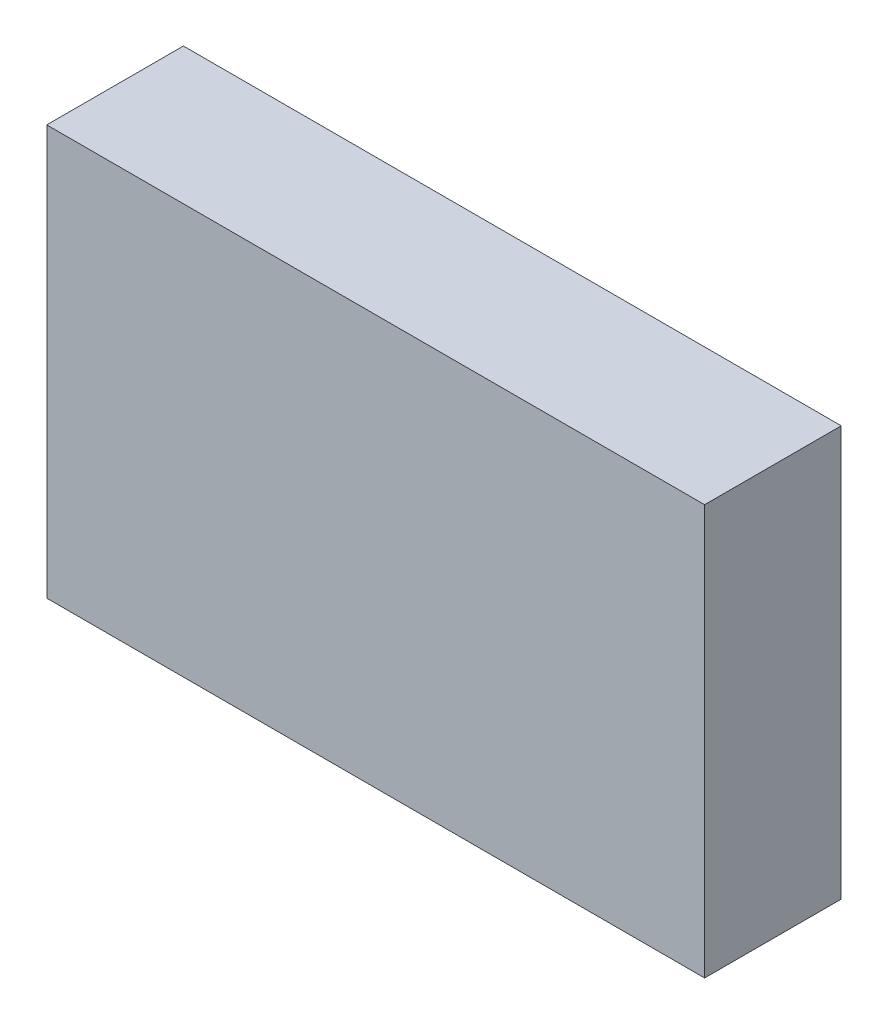
ISO-10303-21;
HEADER;
FILE_DESCRIPTION(('STEP AP214'),'2;1');
FILE_NAME('part.step','',(''),(''),'','','');
FILE_SCHEMA(('AUTOMOTIVE_DESIGN { 1 0 10303 214 1 1 1 1 }'));
ENDSEC;
DATA;
#1=APPLICATION_CONTEXT('core data for automotive mechanical design processes');
#2=APPLICATION_PROTOCOL_DEFINITION('international standard','automotive_design',2000,#1);
#3=PRODUCT_CONTEXT('',#1,'mechanical');
#4=PRODUCT('Part','Part','',(#3));
#5=PRODUCT_RELATED_PRODUCT_CATEGORY('part','',(#4));
#6=PRODUCT_DEFINITION_FORMATION('','',#4);
#7=PRODUCT_DEFINITION_CONTEXT('part definition',#1,'design');
#8=PRODUCT_DEFINITION('design','',#6,#7);
#9=PRODUCT_DEFINITION_SHAPE('','',#8);
#10=(LENGTH_UNIT() NAMED_UNIT(*) SI_UNIT(.MILLI.,.METRE.));
#11=(NAMED_UNIT(*) PLANE_ANGLE_UNIT() SI_UNIT($,.RADIAN.));
#12=(NAMED_UNIT(*) SI_UNIT($,.STERADIAN.) SOLID_ANGLE_UNIT());
#13=UNCERTAINTY_MEASURE_WITH_UNIT(LENGTH_MEASURE(1.E-05),#10,'distance_accuracy_value','');
#14=(GEOMETRIC_REPRESENTATION_CONTEXT(3) GLOBAL_UNCERTAINTY_ASSIGNED_CONTEXT((#13)) GLOBAL_UNIT_ASSIGNED_CONTEXT((#10,
#11,#12)) REPRESENTATION_CONTEXT('',''));
#15=CARTESIAN_POINT('',(0.,0.,0.));
#16=DIRECTION('',(0.,0.,1.));
#17=DIRECTION('',(1.,0.,0.));
#18=AXIS2_PLACEMENT_3D('',#15,#16,#17);
#19=CARTESIAN_POINT('',(-0.0762,-1.0287,0.7366));
#20=DIRECTION('',(0.,0.,1.));
#21=DIRECTION('',(1.,0.,0.));
#22=AXIS2_PLACEMENT_3D('',#19,#20,#21);
#23=PLANE('',#22);
#24=DIRECTION('',(0.,1.,0.));
#25=VECTOR('',#24,1.);
#26=CARTESIAN_POINT('',(3.2258,-1.0287,0.7366));
#27=LINE('',#26,#25);
#28=CARTESIAN_POINT('',(3.2258,1.0287,0.7366));
#29=VERTEX_POINT('',#28);
#30=CARTESIAN_POINT('',(3.2258,-1.0287,0.7366));
#31=VERTEX_POINT('',#30);
#32=EDGE_CURVE('E76',#29,#31,#27,.F.);
#33=ORIENTED_EDGE('',*,*,#32,.F.);
#34=DIRECTION('',(1.,0.,0.));
#35=VECTOR('',#34,1.);
#36=CARTESIAN_POINT('',(-0.0762,1.0287,0.7366));
#37=LINE('',#36,#35);
#38=CARTESIAN_POINT('',(-0.0762,1.0287,0.7366));
#39=VERTEX_POINT('',#38);
#40=EDGE_CURVE('E58',#39,#29,#37,.T.);
#41=ORIENTED_EDGE('',*,*,#40,.F.);
#42=DIRECTION('',(0.,1.,0.));
#43=VECTOR('',#42,1.);
#44=CARTESIAN_POINT('',(-0.0762,-1.0287,0.7366));
#45=LINE('',#44,#43);
#46=CARTESIAN_POINT('',(-0.0762,-1.0287,0.7366));
#47=VERTEX_POINT('',#46);
#48=EDGE_CURVE('E20',#39,#47,#45,.F.);
#49=ORIENTED_EDGE('',*,*,#48,.T.);
#50=DIRECTION('',(1.,0.,0.));
#51=VECTOR('',#50,1.);
#52=CARTESIAN_POINT('',(-0.0762,-1.0287,0.7366));
#53=LINE('',#52,#51);
#54=EDGE_CURVE('E55',#47,#31,#53,.T.);
#55=ORIENTED_EDGE('',*,*,#54,.T.);
#56=EDGE_LOOP('',(#33,#41,#49,#55));
#57=FACE_BOUND('',#56,.T.);
#58=ADVANCED_FACE('F17',(#57),#23,.T.);
#59=CARTESIAN_POINT('',(-0.0762,-1.0287,0.0508));
#60=DIRECTION('',(1.,0.,0.));
#61=DIRECTION('',(0.,0.,-1.));
#62=AXIS2_PLACEMENT_3D('',#59,#60,#61);
#63=PLANE('',#62);
#64=DIRECTION('',(0.,0.,1.));
#65=VECTOR('',#64,1.);
#66=CARTESIAN_POINT('',(-0.0762,1.0287,0.0508));
#67=LINE('',#66,#65);
#68=CARTESIAN_POINT('',(-0.0762,1.0287,0.0508));
#69=VERTEX_POINT('',#68);
#70=EDGE_CURVE('E78',#69,#39,#67,.T.);
#71=ORIENTED_EDGE('',*,*,#70,.F.);
#72=DIRECTION('',(0.,1.,0.));
#73=VECTOR('',#72,1.);
#74=CARTESIAN_POINT('',(-0.0762,-1.0287,0.0508));
#75=LINE('',#74,#73);
#76=CARTESIAN_POINT('',(-0.0762,-1.0287,0.0508));
#77=VERTEX_POINT('',#76);
#78=EDGE_CURVE('E73',#69,#77,#75,.F.);
#79=ORIENTED_EDGE('',*,*,#78,.T.);
#80=DIRECTION('',(0.,0.,1.));
#81=VECTOR('',#80,1.);
#82=CARTESIAN_POINT('',(-0.0762,-1.0287,0.0508));
#83=LINE('',#82,#81);
#84=EDGE_CURVE('E63',#77,#47,#83,.T.);
#85=ORIENTED_EDGE('',*,*,#84,.T.);
#86=ORIENTED_EDGE('',*,*,#48,.F.);
#87=EDGE_LOOP('',(#71,#79,#85,#86));
#88=FACE_BOUND('',#87,.T.);
#89=ADVANCED_FACE('F72',(#88),#63,.F.);
#90=CARTESIAN_POINT('',(-0.0762,-1.0287,0.0508));
#91=DIRECTION('',(0.,1.,0.));
#92=DIRECTION('',(0.,0.,1.));
#93=AXIS2_PLACEMENT_3D('',#90,#91,#92);
#94=PLANE('',#93);
#95=ORIENTED_EDGE('',*,*,#54,.F.);
#96=ORIENTED_EDGE('',*,*,#84,.F.);
#97=DIRECTION('',(1.,0.,0.));
#98=VECTOR('',#97,1.);
#99=CARTESIAN_POINT('',(-0.0762,-1.0287,0.0508));
#100=LINE('',#99,#98);
#101=CARTESIAN_POINT('',(3.2258,-1.0287,0.0508));
#102=VERTEX_POINT('',#101);
#103=EDGE_CURVE('E83',#77,#102,#100,.T.);
#104=ORIENTED_EDGE('',*,*,#103,.T.);
#105=DIRECTION('',(0.,0.,-1.));
#106=VECTOR('',#105,1.);
#107=CARTESIAN_POINT('',(3.2258,-1.0287,0.0508));
#108=LINE('',#107,#106);
#109=EDGE_CURVE('E69',#31,#102,#108,.T.);
#110=ORIENTED_EDGE('',*,*,#109,.F.);
#111=EDGE_LOOP('',(#95,#96,#104,#110));
#112=FACE_BOUND('',#111,.T.);
#113=ADVANCED_FACE('F66',(#112),#94,.F.);
#114=CARTESIAN_POINT('',(3.2258,-1.0287,0.0508));
#115=DIRECTION('',(1.,0.,0.));
#116=DIRECTION('',(0.,0.,-1.));
#117=AXIS2_PLACEMENT_3D('',#114,#115,#116);
#118=PLANE('',#117);
#119=DIRECTION('',(0.,0.,1.));
#120=VECTOR('',#119,1.);
#121=CARTESIAN_POINT('',(3.2258,1.0287,0.0508));
#122=LINE('',#121,#120);
#123=CARTESIAN_POINT('',(3.2258,1.0287,0.0508));
#124=VERTEX_POINT('',#123);
#125=EDGE_CURVE('E34',#29,#124,#122,.F.);
#126=ORIENTED_EDGE('',*,*,#125,.F.);
#127=ORIENTED_EDGE('',*,*,#32,.T.);
#128=ORIENTED_EDGE('',*,*,#109,.T.);
#129=DIRECTION('',(0.,1.,0.));
#130=VECTOR('',#129,1.);
#131=CARTESIAN_POINT('',(3.2258,-1.0287,0.0508));
#132=LINE('',#131,#130);
#133=EDGE_CURVE('E26',#102,#124,#132,.T.);
#134=ORIENTED_EDGE('',*,*,#133,.T.);
#135=EDGE_LOOP('',(#126,#127,#128,#134));
#136=FACE_BOUND('',#135,.T.);
#137=ADVANCED_FACE('F88',(#136),#118,.T.);
#138=CARTESIAN_POINT('',(-0.0762,1.0287,0.0508));
#139=DIRECTION('',(0.,1.,0.));
#140=DIRECTION('',(0.,0.,1.));
#141=AXIS2_PLACEMENT_3D('',#138,#139,#140);
#142=PLANE('',#141);
#143=ORIENTED_EDGE('',*,*,#40,.T.);
#144=ORIENTED_EDGE('',*,*,#125,.T.);
#145=DIRECTION('',(1.,0.,0.));
#146=VECTOR('',#145,1.);
#147=CARTESIAN_POINT('',(-0.0762,1.0287,0.0508));
#148=LINE('',#147,#146);
#149=EDGE_CURVE('E11',#124,#69,#148,.F.);
#150=ORIENTED_EDGE('',*,*,#149,.T.);
#151=ORIENTED_EDGE('',*,*,#70,.T.);
#152=EDGE_LOOP('',(#143,#144,#150,#151));
#153=FACE_BOUND('',#152,.T.);
#154=ADVANCED_FACE('F91',(#153),#142,.T.);
#155=CARTESIAN_POINT('',(-0.0762,-1.0287,0.0508));
#156=DIRECTION('',(0.,0.,1.));
#157=DIRECTION('',(1.,0.,0.));
#158=AXIS2_PLACEMENT_3D('',#155,#156,#157);
#159=PLANE('',#158);
#160=ORIENTED_EDGE('',*,*,#133,.F.);
#161=ORIENTED_EDGE('',*,*,#103,.F.);
#162=ORIENTED_EDGE('',*,*,#78,.F.);
#163=ORIENTED_EDGE('',*,*,#149,.F.);
#164=EDGE_LOOP('',(#160,#161,#162,#163));
#165=FACE_BOUND('',#164,.T.);
#166=ADVANCED_FACE('F90',(#165),#159,.F.);
#167=CLOSED_SHELL('',(#58,#89,#113,#137,#154,#166));
#168=MANIFOLD_SOLID_BREP('B1',#167);
#169=ADVANCED_BREP_SHAPE_REPRESENTATION('',(#18,#168),#14);
#170=SHAPE_DEFINITION_REPRESENTATION(#9,#169);
ENDSEC;
END-ISO-10303-21;
